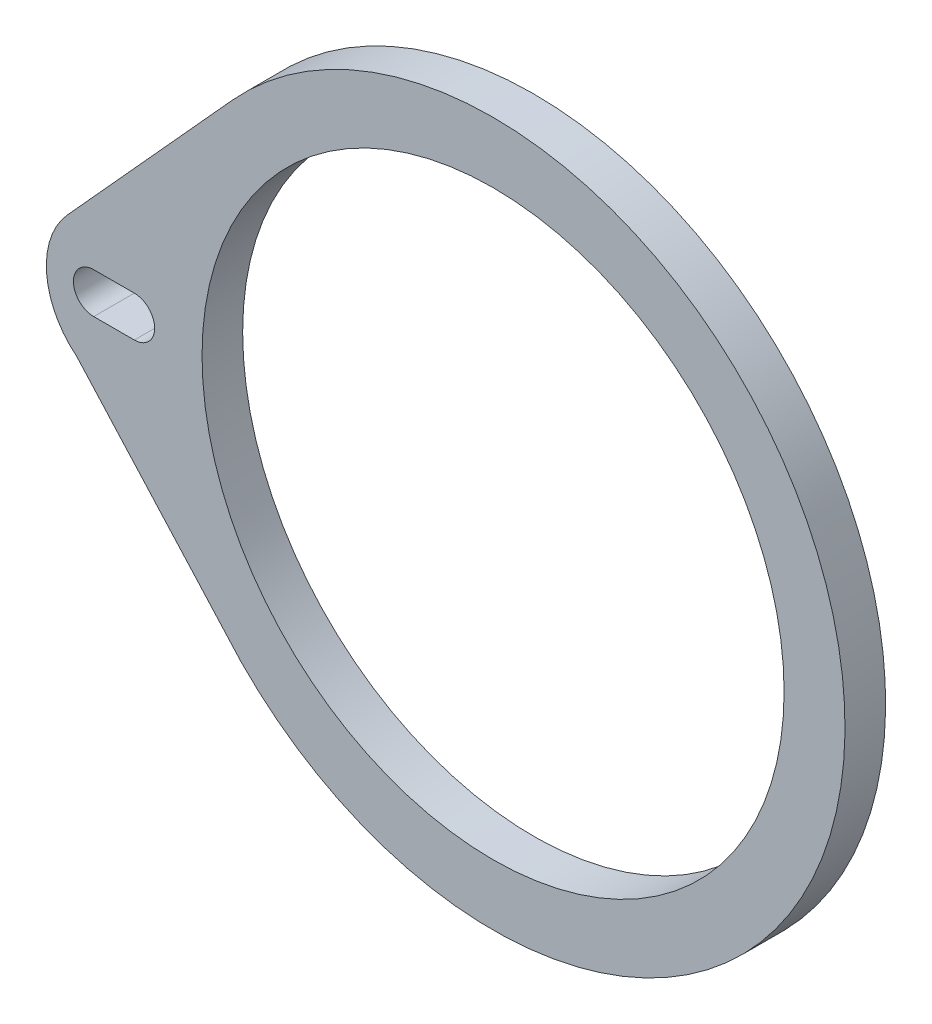
ISO-10303-21;
HEADER;
FILE_DESCRIPTION(('STEP AP214'),'2;1');
FILE_NAME('part.step','',(''),(''),'','','');
FILE_SCHEMA(('AUTOMOTIVE_DESIGN { 1 0 10303 214 1 1 1 1 }'));
ENDSEC;
DATA;
#1=APPLICATION_CONTEXT('core data for automotive mechanical design processes');
#2=APPLICATION_PROTOCOL_DEFINITION('international standard','automotive_design',2000,#1);
#3=PRODUCT_CONTEXT('',#1,'mechanical');
#4=PRODUCT('Part','Part','',(#3));
#5=PRODUCT_RELATED_PRODUCT_CATEGORY('part','',(#4));
#6=PRODUCT_DEFINITION_FORMATION('','',#4);
#7=PRODUCT_DEFINITION_CONTEXT('part definition',#1,'design');
#8=PRODUCT_DEFINITION('design','',#6,#7);
#9=PRODUCT_DEFINITION_SHAPE('','',#8);
#10=(LENGTH_UNIT() NAMED_UNIT(*) SI_UNIT(.MILLI.,.METRE.));
#11=(NAMED_UNIT(*) PLANE_ANGLE_UNIT() SI_UNIT($,.RADIAN.));
#12=(NAMED_UNIT(*) SI_UNIT($,.STERADIAN.) SOLID_ANGLE_UNIT());
#13=UNCERTAINTY_MEASURE_WITH_UNIT(LENGTH_MEASURE(1.E-05),#10,'distance_accuracy_value','');
#14=(GEOMETRIC_REPRESENTATION_CONTEXT(3) GLOBAL_UNCERTAINTY_ASSIGNED_CONTEXT((#13)) GLOBAL_UNIT_ASSIGNED_CONTEXT((#10,
#11,#12)) REPRESENTATION_CONTEXT('',''));
#15=CARTESIAN_POINT('',(0.,0.,0.));
#16=DIRECTION('',(0.,0.,1.));
#17=DIRECTION('',(1.,0.,0.));
#18=AXIS2_PLACEMENT_3D('',#15,#16,#17);
#19=CARTESIAN_POINT('',(0.,0.,3.));
#20=DIRECTION('',(0.,0.,-1.));
#21=DIRECTION('',(-1.,0.,0.));
#22=AXIS2_PLACEMENT_3D('',#19,#20,#21);
#23=CYLINDRICAL_SURFACE('',#22,26.);
#24=CARTESIAN_POINT('',(0.,0.,0.));
#25=DIRECTION('',(0.,0.,1.));
#26=DIRECTION('',(1.,0.,0.));
#27=AXIS2_PLACEMENT_3D('',#24,#25,#26);
#28=CIRCLE('',#27,26.);
#29=CARTESIAN_POINT('',(-18.6142029100198,-18.1524502485094,0.));
#30=VERTEX_POINT('',#29);
#31=CARTESIAN_POINT('',(-19.2592592592592,17.4665661417646,0.));
#32=VERTEX_POINT('',#31);
#33=EDGE_CURVE('E140',#30,#32,#28,.T.);
#34=ORIENTED_EDGE('',*,*,#33,.T.);
#35=DIRECTION('',(0.,0.,-1.));
#36=VECTOR('',#35,1.);
#37=CARTESIAN_POINT('',(-19.2592592592592,17.4665661417646,3.));
#38=LINE('',#37,#36);
#39=CARTESIAN_POINT('',(-19.2592592592592,17.4665661417646,3.));
#40=VERTEX_POINT('',#39);
#41=EDGE_CURVE('E11',#40,#32,#38,.T.);
#42=ORIENTED_EDGE('',*,*,#41,.F.);
#43=CARTESIAN_POINT('',(0.,0.,3.));
#44=DIRECTION('',(0.,0.,1.));
#45=DIRECTION('',(1.,0.,0.));
#46=AXIS2_PLACEMENT_3D('',#43,#44,#45);
#47=CIRCLE('',#46,26.);
#48=CARTESIAN_POINT('',(-18.6142029100198,-18.1524502485094,3.));
#49=VERTEX_POINT('',#48);
#50=EDGE_CURVE('E141',#49,#40,#47,.T.);
#51=ORIENTED_EDGE('',*,*,#50,.F.);
#52=DIRECTION('',(0.,0.,-1.));
#53=VECTOR('',#52,1.);
#54=CARTESIAN_POINT('',(-18.6142029100198,-18.1524502485094,3.));
#55=LINE('',#54,#53);
#56=EDGE_CURVE('E151',#49,#30,#55,.T.);
#57=ORIENTED_EDGE('',*,*,#56,.T.);
#58=EDGE_LOOP('',(#34,#42,#51,#57));
#59=FACE_BOUND('',#58,.T.);
#60=ADVANCED_FACE('F35',(#59),#23,.T.);
#61=CARTESIAN_POINT('',(-19.2592592592592,17.4665661417646,3.));
#62=DIRECTION('',(0.740740740740741,-0.671791005452483,0.));
#63=DIRECTION('',(0.671791005452484,0.740740740740741,0.));
#64=AXIS2_PLACEMENT_3D('',#61,#62,#63);
#65=PLANE('',#64);
#66=DIRECTION('',(-0.671791005452483,-0.740740740740741,0.));
#67=VECTOR('',#66,1.);
#68=CARTESIAN_POINT('',(-19.2592592592592,17.4665661417646,0.));
#69=LINE('',#68,#67);
#70=CARTESIAN_POINT('',(-31.4444444444444,4.0307460327149,0.));
#71=VERTEX_POINT('',#70);
#72=EDGE_CURVE('E154',#32,#71,#69,.T.);
#73=ORIENTED_EDGE('',*,*,#72,.T.);
#74=DIRECTION('',(0.,0.,-1.));
#75=VECTOR('',#74,1.);
#76=CARTESIAN_POINT('',(-31.4444444444444,4.0307460327149,3.));
#77=LINE('',#76,#75);
#78=CARTESIAN_POINT('',(-31.4444444444444,4.0307460327149,3.));
#79=VERTEX_POINT('',#78);
#80=EDGE_CURVE('E42',#79,#71,#77,.T.);
#81=ORIENTED_EDGE('',*,*,#80,.F.);
#82=DIRECTION('',(-0.671791005452483,-0.740740740740741,0.));
#83=VECTOR('',#82,1.);
#84=CARTESIAN_POINT('',(-19.2592592592592,17.4665661417646,3.));
#85=LINE('',#84,#83);
#86=EDGE_CURVE('E144',#40,#79,#85,.T.);
#87=ORIENTED_EDGE('',*,*,#86,.F.);
#88=ORIENTED_EDGE('',*,*,#41,.T.);
#89=EDGE_LOOP('',(#73,#81,#87,#88));
#90=FACE_BOUND('',#89,.T.);
#91=ADVANCED_FACE('F183',(#90),#65,.F.);
#92=CARTESIAN_POINT('',(-27.,0.,3.));
#93=DIRECTION('',(0.,0.,-1.));
#94=DIRECTION('',(-1.,0.,0.));
#95=AXIS2_PLACEMENT_3D('',#92,#93,#94);
#96=CYLINDRICAL_SURFACE('',#95,6.);
#97=CARTESIAN_POINT('',(-27.,0.,0.));
#98=DIRECTION('',(0.,0.,1.));
#99=DIRECTION('',(1.,0.,0.));
#100=AXIS2_PLACEMENT_3D('',#97,#98,#99);
#101=CIRCLE('',#100,6.);
#102=CARTESIAN_POINT('',(-30.7568980718205,-4.67821727562446,0.));
#103=VERTEX_POINT('',#102);
#104=EDGE_CURVE('E156',#71,#103,#101,.T.);
#105=ORIENTED_EDGE('',*,*,#104,.T.);
#106=DIRECTION('',(0.,0.,-1.));
#107=VECTOR('',#106,1.);
#108=CARTESIAN_POINT('',(-30.7568980718205,-4.67821727562446,3.));
#109=LINE('',#108,#107);
#110=CARTESIAN_POINT('',(-30.7568980718205,-4.67821727562446,3.));
#111=VERTEX_POINT('',#110);
#112=EDGE_CURVE('E161',#111,#103,#109,.T.);
#113=ORIENTED_EDGE('',*,*,#112,.F.);
#114=CARTESIAN_POINT('',(-27.,0.,3.));
#115=DIRECTION('',(0.,0.,1.));
#116=DIRECTION('',(1.,0.,0.));
#117=AXIS2_PLACEMENT_3D('',#114,#115,#116);
#118=CIRCLE('',#117,6.);
#119=EDGE_CURVE('E147',#79,#111,#118,.T.);
#120=ORIENTED_EDGE('',*,*,#119,.F.);
#121=ORIENTED_EDGE('',*,*,#80,.T.);
#122=EDGE_LOOP('',(#105,#113,#120,#121));
#123=FACE_BOUND('',#122,.T.);
#124=ADVANCED_FACE('F168',(#123),#96,.T.);
#125=CARTESIAN_POINT('',(-30.7568980718205,-4.67821727562446,3.));
#126=DIRECTION('',(0.742858510477192,0.669448454633819,0.));
#127=DIRECTION('',(-0.669448454633819,0.742858510477192,0.));
#128=AXIS2_PLACEMENT_3D('',#125,#126,#127);
#129=PLANE('',#128);
#130=DIRECTION('',(0.669448454633819,-0.742858510477192,0.));
#131=VECTOR('',#130,1.);
#132=CARTESIAN_POINT('',(-30.7568980718205,-4.67821727562446,0.));
#133=LINE('',#132,#131);
#134=EDGE_CURVE('E145',#103,#30,#133,.T.);
#135=ORIENTED_EDGE('',*,*,#134,.T.);
#136=ORIENTED_EDGE('',*,*,#56,.F.);
#137=DIRECTION('',(0.669448454633819,-0.742858510477192,0.));
#138=VECTOR('',#137,1.);
#139=CARTESIAN_POINT('',(-30.7568980718205,-4.67821727562446,3.));
#140=LINE('',#139,#138);
#141=EDGE_CURVE('E149',#111,#49,#140,.T.);
#142=ORIENTED_EDGE('',*,*,#141,.F.);
#143=ORIENTED_EDGE('',*,*,#112,.T.);
#144=EDGE_LOOP('',(#135,#136,#142,#143));
#145=FACE_BOUND('',#144,.T.);
#146=ADVANCED_FACE('F176',(#145),#129,.F.);
#147=CARTESIAN_POINT('',(0.,0.,3.));
#148=DIRECTION('',(0.,0.,1.));
#149=DIRECTION('',(1.,0.,0.));
#150=AXIS2_PLACEMENT_3D('',#147,#148,#149);
#151=PLANE('',#150);
#152=CARTESIAN_POINT('',(-26.5,0.,3.));
#153=DIRECTION('',(0.,0.,1.));
#154=DIRECTION('',(1.,0.,0.));
#155=AXIS2_PLACEMENT_3D('',#152,#153,#154);
#156=CIRCLE('',#155,1.5);
#157=CARTESIAN_POINT('',(-26.5,-1.5,3.));
#158=VERTEX_POINT('',#157);
#159=CARTESIAN_POINT('',(-26.5,1.5,3.));
#160=VERTEX_POINT('',#159);
#161=EDGE_CURVE('E132',#158,#160,#156,.T.);
#162=ORIENTED_EDGE('',*,*,#161,.F.);
#163=DIRECTION('',(1.,0.,0.));
#164=VECTOR('',#163,1.);
#165=CARTESIAN_POINT('',(0.,-1.50000000000001,3.));
#166=LINE('',#165,#164);
#167=CARTESIAN_POINT('',(-29.5,-1.5,3.));
#168=VERTEX_POINT('',#167);
#169=EDGE_CURVE('E125',#168,#158,#166,.T.);
#170=ORIENTED_EDGE('',*,*,#169,.F.);
#171=CARTESIAN_POINT('',(-29.5,0.,3.));
#172=DIRECTION('',(0.,0.,1.));
#173=DIRECTION('',(1.,0.,0.));
#174=AXIS2_PLACEMENT_3D('',#171,#172,#173);
#175=CIRCLE('',#174,1.5);
#176=CARTESIAN_POINT('',(-29.5,1.5,3.));
#177=VERTEX_POINT('',#176);
#178=EDGE_CURVE('E105',#177,#168,#175,.T.);
#179=ORIENTED_EDGE('',*,*,#178,.F.);
#180=DIRECTION('',(-1.,0.,0.));
#181=VECTOR('',#180,1.);
#182=CARTESIAN_POINT('',(0.,1.49999999999999,3.));
#183=LINE('',#182,#181);
#184=EDGE_CURVE('E130',#160,#177,#183,.T.);
#185=ORIENTED_EDGE('',*,*,#184,.F.);
#186=EDGE_LOOP('',(#162,#170,#179,#185));
#187=FACE_BOUND('',#186,.T.);
#188=CARTESIAN_POINT('',(0.,0.,3.));
#189=DIRECTION('',(0.,0.,1.));
#190=DIRECTION('',(1.,0.,0.));
#191=AXIS2_PLACEMENT_3D('',#188,#189,#190);
#192=CIRCLE('',#191,21.5);
#193=CARTESIAN_POINT('',(21.5,0.,3.));
#194=VERTEX_POINT('',#193);
#195=EDGE_CURVE('E137',#194,#194,#192,.T.);
#196=ORIENTED_EDGE('',*,*,#195,.F.);
#197=EDGE_LOOP('',(#196));
#198=FACE_BOUND('',#197,.T.);
#199=ORIENTED_EDGE('',*,*,#50,.T.);
#200=ORIENTED_EDGE('',*,*,#86,.T.);
#201=ORIENTED_EDGE('',*,*,#119,.T.);
#202=ORIENTED_EDGE('',*,*,#141,.T.);
#203=EDGE_LOOP('',(#199,#200,#201,#202));
#204=FACE_BOUND('',#203,.T.);
#205=ADVANCED_FACE('F182',(#187,#198,#204),#151,.T.);
#206=CARTESIAN_POINT('',(0.,0.,0.));
#207=DIRECTION('',(0.,0.,1.));
#208=DIRECTION('',(1.,0.,0.));
#209=AXIS2_PLACEMENT_3D('',#206,#207,#208);
#210=PLANE('',#209);
#211=DIRECTION('',(-1.,0.,0.));
#212=VECTOR('',#211,1.);
#213=CARTESIAN_POINT('',(-26.5,-1.5,0.));
#214=LINE('',#213,#212);
#215=CARTESIAN_POINT('',(-26.5,-1.5,0.));
#216=VERTEX_POINT('',#215);
#217=CARTESIAN_POINT('',(-29.5,-1.5,0.));
#218=VERTEX_POINT('',#217);
#219=EDGE_CURVE('E111',#216,#218,#214,.T.);
#220=ORIENTED_EDGE('',*,*,#219,.F.);
#221=CARTESIAN_POINT('',(-26.5,0.,0.));
#222=DIRECTION('',(0.,0.,-1.));
#223=DIRECTION('',(-1.,0.,0.));
#224=AXIS2_PLACEMENT_3D('',#221,#222,#223);
#225=CIRCLE('',#224,1.5);
#226=CARTESIAN_POINT('',(-26.5,1.5,0.));
#227=VERTEX_POINT('',#226);
#228=EDGE_CURVE('E57',#227,#216,#225,.T.);
#229=ORIENTED_EDGE('',*,*,#228,.F.);
#230=DIRECTION('',(1.,0.,0.));
#231=VECTOR('',#230,1.);
#232=CARTESIAN_POINT('',(-26.5,1.5,0.));
#233=LINE('',#232,#231);
#234=CARTESIAN_POINT('',(-29.5,1.5,0.));
#235=VERTEX_POINT('',#234);
#236=EDGE_CURVE('E118',#235,#227,#233,.T.);
#237=ORIENTED_EDGE('',*,*,#236,.F.);
#238=CARTESIAN_POINT('',(-29.5,0.,0.));
#239=DIRECTION('',(0.,0.,-1.));
#240=DIRECTION('',(-1.,0.,0.));
#241=AXIS2_PLACEMENT_3D('',#238,#239,#240);
#242=CIRCLE('',#241,1.5);
#243=EDGE_CURVE('E102',#218,#235,#242,.T.);
#244=ORIENTED_EDGE('',*,*,#243,.F.);
#245=EDGE_LOOP('',(#220,#229,#237,#244));
#246=FACE_BOUND('',#245,.T.);
#247=CARTESIAN_POINT('',(0.,0.,0.));
#248=DIRECTION('',(0.,0.,-1.));
#249=DIRECTION('',(-1.,0.,0.));
#250=AXIS2_PLACEMENT_3D('',#247,#248,#249);
#251=CIRCLE('',#250,21.5);
#252=CARTESIAN_POINT('',(-21.5,0.,0.));
#253=VERTEX_POINT('',#252);
#254=EDGE_CURVE('E134',#253,#253,#251,.T.);
#255=ORIENTED_EDGE('',*,*,#254,.F.);
#256=EDGE_LOOP('',(#255));
#257=FACE_BOUND('',#256,.T.);
#258=ORIENTED_EDGE('',*,*,#33,.F.);
#259=ORIENTED_EDGE('',*,*,#134,.F.);
#260=ORIENTED_EDGE('',*,*,#104,.F.);
#261=ORIENTED_EDGE('',*,*,#72,.F.);
#262=EDGE_LOOP('',(#258,#259,#260,#261));
#263=FACE_BOUND('',#262,.T.);
#264=ADVANCED_FACE('F115',(#246,#257,#263),#210,.F.);
#265=CARTESIAN_POINT('',(0.,0.,10.));
#266=DIRECTION('',(0.,0.,-1.));
#267=DIRECTION('',(-1.,0.,0.));
#268=AXIS2_PLACEMENT_3D('',#265,#266,#267);
#269=CYLINDRICAL_SURFACE('',#268,21.5);
#270=ORIENTED_EDGE('',*,*,#195,.T.);
#271=EDGE_LOOP('',(#270));
#272=FACE_BOUND('',#271,.T.);
#273=ORIENTED_EDGE('',*,*,#254,.T.);
#274=EDGE_LOOP('',(#273));
#275=FACE_BOUND('',#274,.T.);
#276=ADVANCED_FACE('F195',(#272,#275),#269,.F.);
#277=CARTESIAN_POINT('',(-26.5,0.,10.));
#278=DIRECTION('',(0.,0.,-1.));
#279=DIRECTION('',(-1.,0.,0.));
#280=AXIS2_PLACEMENT_3D('',#277,#278,#279);
#281=CYLINDRICAL_SURFACE('',#280,1.5);
#282=ORIENTED_EDGE('',*,*,#161,.T.);
#283=DIRECTION('',(0.,0.,-1.));
#284=VECTOR('',#283,1.);
#285=CARTESIAN_POINT('',(-26.5,1.5,10.));
#286=LINE('',#285,#284);
#287=EDGE_CURVE('E123',#160,#227,#286,.T.);
#288=ORIENTED_EDGE('',*,*,#287,.T.);
#289=ORIENTED_EDGE('',*,*,#228,.T.);
#290=DIRECTION('',(0.,0.,-1.));
#291=VECTOR('',#290,1.);
#292=CARTESIAN_POINT('',(-26.5,-1.5,10.));
#293=LINE('',#292,#291);
#294=EDGE_CURVE('E108',#158,#216,#293,.T.);
#295=ORIENTED_EDGE('',*,*,#294,.F.);
#296=EDGE_LOOP('',(#282,#288,#289,#295));
#297=FACE_BOUND('',#296,.T.);
#298=ADVANCED_FACE('F201',(#297),#281,.F.);
#299=CARTESIAN_POINT('',(-26.5,1.5,10.));
#300=DIRECTION('',(0.,1.,0.));
#301=DIRECTION('',(-1.,0.,0.));
#302=AXIS2_PLACEMENT_3D('',#299,#300,#301);
#303=PLANE('',#302);
#304=ORIENTED_EDGE('',*,*,#184,.T.);
#305=DIRECTION('',(0.,0.,-1.));
#306=VECTOR('',#305,1.);
#307=CARTESIAN_POINT('',(-29.5,1.5,10.));
#308=LINE('',#307,#306);
#309=EDGE_CURVE('E107',#177,#235,#308,.T.);
#310=ORIENTED_EDGE('',*,*,#309,.T.);
#311=ORIENTED_EDGE('',*,*,#236,.T.);
#312=ORIENTED_EDGE('',*,*,#287,.F.);
#313=EDGE_LOOP('',(#304,#310,#311,#312));
#314=FACE_BOUND('',#313,.T.);
#315=ADVANCED_FACE('F205',(#314),#303,.F.);
#316=CARTESIAN_POINT('',(-29.5,0.,10.));
#317=DIRECTION('',(0.,0.,-1.));
#318=DIRECTION('',(-1.,0.,0.));
#319=AXIS2_PLACEMENT_3D('',#316,#317,#318);
#320=CYLINDRICAL_SURFACE('',#319,1.5);
#321=ORIENTED_EDGE('',*,*,#178,.T.);
#322=DIRECTION('',(0.,0.,-1.));
#323=VECTOR('',#322,1.);
#324=CARTESIAN_POINT('',(-29.5,-1.5,10.));
#325=LINE('',#324,#323);
#326=EDGE_CURVE('E49',#168,#218,#325,.T.);
#327=ORIENTED_EDGE('',*,*,#326,.T.);
#328=ORIENTED_EDGE('',*,*,#243,.T.);
#329=ORIENTED_EDGE('',*,*,#309,.F.);
#330=EDGE_LOOP('',(#321,#327,#328,#329));
#331=FACE_BOUND('',#330,.T.);
#332=ADVANCED_FACE('F99',(#331),#320,.F.);
#333=CARTESIAN_POINT('',(-26.5,-1.5,10.));
#334=DIRECTION('',(0.,-1.,0.));
#335=DIRECTION('',(1.,0.,0.));
#336=AXIS2_PLACEMENT_3D('',#333,#334,#335);
#337=PLANE('',#336);
#338=ORIENTED_EDGE('',*,*,#169,.T.);
#339=ORIENTED_EDGE('',*,*,#294,.T.);
#340=ORIENTED_EDGE('',*,*,#219,.T.);
#341=ORIENTED_EDGE('',*,*,#326,.F.);
#342=EDGE_LOOP('',(#338,#339,#340,#341));
#343=FACE_BOUND('',#342,.T.);
#344=ADVANCED_FACE('F112',(#343),#337,.F.);
#345=CLOSED_SHELL('',(#60,#91,#124,#146,#205,#264,#276,#298,#315,#332,#344));
#346=MANIFOLD_SOLID_BREP('B2',#345);
#347=ADVANCED_BREP_SHAPE_REPRESENTATION('',(#18,#346),#14);
#348=SHAPE_DEFINITION_REPRESENTATION(#9,#347);
ENDSEC;
END-ISO-10303-21;
